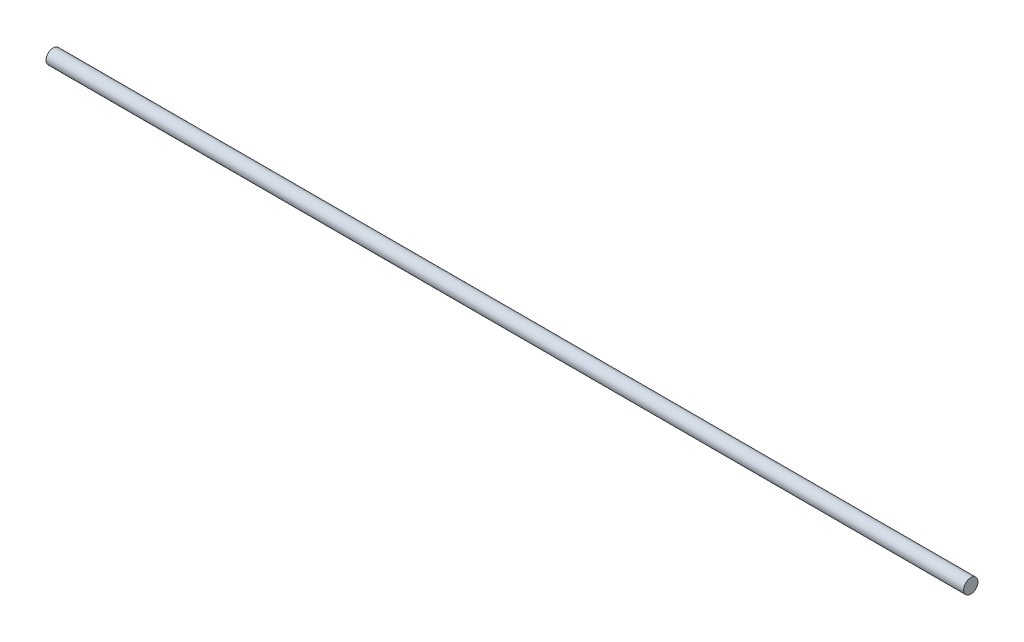
ISO-10303-21;
HEADER;
FILE_DESCRIPTION(('STEP AP214'),'2;1');
FILE_NAME('part.step','',(''),(''),'','','');
FILE_SCHEMA(('AUTOMOTIVE_DESIGN { 1 0 10303 214 1 1 1 1 }'));
ENDSEC;
DATA;
#1=APPLICATION_CONTEXT('core data for automotive mechanical design processes');
#2=APPLICATION_PROTOCOL_DEFINITION('international standard','automotive_design',2000,#1);
#3=PRODUCT_CONTEXT('',#1,'mechanical');
#4=PRODUCT('Part','Part','',(#3));
#5=PRODUCT_RELATED_PRODUCT_CATEGORY('part','',(#4));
#6=PRODUCT_DEFINITION_FORMATION('','',#4);
#7=PRODUCT_DEFINITION_CONTEXT('part definition',#1,'design');
#8=PRODUCT_DEFINITION('design','',#6,#7);
#9=PRODUCT_DEFINITION_SHAPE('','',#8);
#10=(LENGTH_UNIT() NAMED_UNIT(*) SI_UNIT(.MILLI.,.METRE.));
#11=(NAMED_UNIT(*) PLANE_ANGLE_UNIT() SI_UNIT($,.RADIAN.));
#12=(NAMED_UNIT(*) SI_UNIT($,.STERADIAN.) SOLID_ANGLE_UNIT());
#13=UNCERTAINTY_MEASURE_WITH_UNIT(LENGTH_MEASURE(1.E-05),#10,'distance_accuracy_value','');
#14=(GEOMETRIC_REPRESENTATION_CONTEXT(3) GLOBAL_UNCERTAINTY_ASSIGNED_CONTEXT((#13)) GLOBAL_UNIT_ASSIGNED_CONTEXT((#10,
#11,#12)) REPRESENTATION_CONTEXT('',''));
#15=CARTESIAN_POINT('',(0.,0.,0.));
#16=DIRECTION('',(0.,0.,1.));
#17=DIRECTION('',(1.,0.,0.));
#18=AXIS2_PLACEMENT_3D('',#15,#16,#17);
#19=CARTESIAN_POINT('',(320.,0.,7.5));
#20=DIRECTION('',(-1.,0.,0.));
#21=DIRECTION('',(0.,0.,1.));
#22=AXIS2_PLACEMENT_3D('',#19,#20,#21);
#23=CYLINDRICAL_SURFACE('',#22,2.5);
#24=CARTESIAN_POINT('',(320.,0.,7.5));
#25=DIRECTION('',(1.,0.,0.));
#26=DIRECTION('',(0.,0.,-1.));
#27=AXIS2_PLACEMENT_3D('',#24,#25,#26);
#28=CIRCLE('',#27,2.5);
#29=CARTESIAN_POINT('',(320.,0.,5.));
#30=VERTEX_POINT('',#29);
#31=EDGE_CURVE('E10',#30,#30,#28,.T.);
#32=ORIENTED_EDGE('',*,*,#31,.F.);
#33=EDGE_LOOP('',(#32));
#34=FACE_BOUND('',#33,.T.);
#35=CARTESIAN_POINT('',(0.,0.,7.5));
#36=DIRECTION('',(1.,0.,0.));
#37=DIRECTION('',(0.,0.,-1.));
#38=AXIS2_PLACEMENT_3D('',#35,#36,#37);
#39=CIRCLE('',#38,2.5);
#40=CARTESIAN_POINT('',(0.,0.,5.));
#41=VERTEX_POINT('',#40);
#42=EDGE_CURVE('E39',#41,#41,#39,.T.);
#43=ORIENTED_EDGE('',*,*,#42,.T.);
#44=EDGE_LOOP('',(#43));
#45=FACE_BOUND('',#44,.T.);
#46=ADVANCED_FACE('F36',(#34,#45),#23,.T.);
#47=CARTESIAN_POINT('',(320.,0.,7.5));
#48=DIRECTION('',(1.,0.,0.));
#49=DIRECTION('',(0.,0.,-1.));
#50=AXIS2_PLACEMENT_3D('',#47,#48,#49);
#51=PLANE('',#50);
#52=ORIENTED_EDGE('',*,*,#31,.T.);
#53=EDGE_LOOP('',(#52));
#54=FACE_BOUND('',#53,.T.);
#55=ADVANCED_FACE('F51',(#54),#51,.T.);
#56=CARTESIAN_POINT('',(0.,0.,7.5));
#57=DIRECTION('',(1.,0.,0.));
#58=DIRECTION('',(0.,0.,-1.));
#59=AXIS2_PLACEMENT_3D('',#56,#57,#58);
#60=PLANE('',#59);
#61=ORIENTED_EDGE('',*,*,#42,.F.);
#62=EDGE_LOOP('',(#61));
#63=FACE_BOUND('',#62,.T.);
#64=ADVANCED_FACE('F49',(#63),#60,.F.);
#65=CLOSED_SHELL('',(#46,#55,#64));
#66=MANIFOLD_SOLID_BREP('B2',#65);
#67=ADVANCED_BREP_SHAPE_REPRESENTATION('',(#18,#66),#14);
#68=SHAPE_DEFINITION_REPRESENTATION(#9,#67);
ENDSEC;
END-ISO-10303-21;
